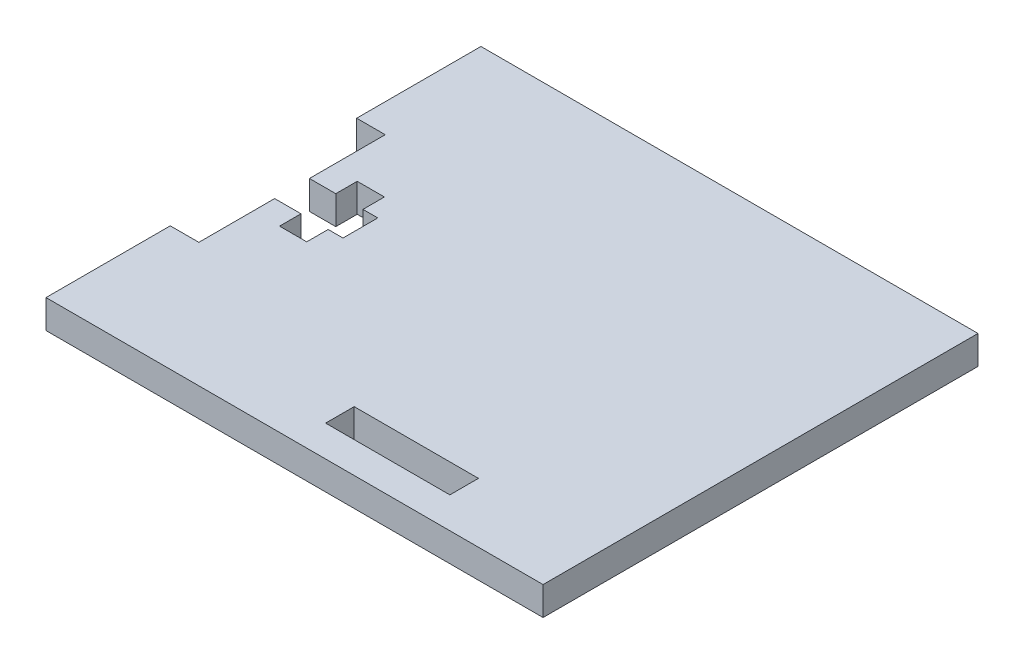
ISO-10303-21;
HEADER;
FILE_DESCRIPTION(('STEP AP214'),'2;1');
FILE_NAME('part.step','',(''),(''),'','','');
FILE_SCHEMA(('AUTOMOTIVE_DESIGN { 1 0 10303 214 1 1 1 1 }'));
ENDSEC;
DATA;
#1=APPLICATION_CONTEXT('core data for automotive mechanical design processes');
#2=APPLICATION_PROTOCOL_DEFINITION('international standard','automotive_design',2000,#1);
#3=PRODUCT_CONTEXT('',#1,'mechanical');
#4=PRODUCT('Part','Part','',(#3));
#5=PRODUCT_RELATED_PRODUCT_CATEGORY('part','',(#4));
#6=PRODUCT_DEFINITION_FORMATION('','',#4);
#7=PRODUCT_DEFINITION_CONTEXT('part definition',#1,'design');
#8=PRODUCT_DEFINITION('design','',#6,#7);
#9=PRODUCT_DEFINITION_SHAPE('','',#8);
#10=(LENGTH_UNIT() NAMED_UNIT(*) SI_UNIT(.MILLI.,.METRE.));
#11=(NAMED_UNIT(*) PLANE_ANGLE_UNIT() SI_UNIT($,.RADIAN.));
#12=(NAMED_UNIT(*) SI_UNIT($,.STERADIAN.) SOLID_ANGLE_UNIT());
#13=UNCERTAINTY_MEASURE_WITH_UNIT(LENGTH_MEASURE(1.E-05),#10,'distance_accuracy_value','');
#14=(GEOMETRIC_REPRESENTATION_CONTEXT(3) GLOBAL_UNCERTAINTY_ASSIGNED_CONTEXT((#13)) GLOBAL_UNIT_ASSIGNED_CONTEXT((#10,
#11,#12)) REPRESENTATION_CONTEXT('',''));
#15=CARTESIAN_POINT('',(0.,0.,0.));
#16=DIRECTION('',(0.,0.,1.));
#17=DIRECTION('',(1.,0.,0.));
#18=AXIS2_PLACEMENT_3D('',#15,#16,#17);
#19=CARTESIAN_POINT('',(0.,2.921,0.));
#20=DIRECTION('',(0.,-1.,0.));
#21=DIRECTION('',(0.,0.,-1.));
#22=AXIS2_PLACEMENT_3D('',#19,#20,#21);
#23=PLANE('',#22);
#24=DIRECTION('',(0.,0.,1.));
#25=VECTOR('',#24,1.);
#26=CARTESIAN_POINT('',(0.,2.921,0.));
#27=LINE('',#26,#25);
#28=CARTESIAN_POINT('',(0.,2.921,-12.7));
#29=VERTEX_POINT('',#28);
#30=CARTESIAN_POINT('',(0.,2.921,0.));
#31=VERTEX_POINT('',#30);
#32=EDGE_CURVE('E229',#29,#31,#27,.T.);
#33=ORIENTED_EDGE('',*,*,#32,.T.);
#34=DIRECTION('',(1.,0.,0.));
#35=VECTOR('',#34,1.);
#36=CARTESIAN_POINT('',(0.,2.921,0.));
#37=LINE('',#36,#35);
#38=CARTESIAN_POINT('',(50.8,2.921,0.));
#39=VERTEX_POINT('',#38);
#40=EDGE_CURVE('E232',#31,#39,#37,.T.);
#41=ORIENTED_EDGE('',*,*,#40,.T.);
#42=DIRECTION('',(0.,0.,-1.));
#43=VECTOR('',#42,1.);
#44=CARTESIAN_POINT('',(50.8,2.921,0.));
#45=LINE('',#44,#43);
#46=CARTESIAN_POINT('',(50.8,2.921,-44.45));
#47=VERTEX_POINT('',#46);
#48=EDGE_CURVE('E235',#39,#47,#45,.T.);
#49=ORIENTED_EDGE('',*,*,#48,.T.);
#50=DIRECTION('',(-1.,0.,0.));
#51=VECTOR('',#50,1.);
#52=CARTESIAN_POINT('',(0.,2.921,-44.45));
#53=LINE('',#52,#51);
#54=CARTESIAN_POINT('',(0.,2.921,-44.45));
#55=VERTEX_POINT('',#54);
#56=EDGE_CURVE('E237',#47,#55,#53,.T.);
#57=ORIENTED_EDGE('',*,*,#56,.T.);
#58=DIRECTION('',(0.,0.,1.));
#59=VECTOR('',#58,1.);
#60=CARTESIAN_POINT('',(0.,2.921,-31.75));
#61=LINE('',#60,#59);
#62=CARTESIAN_POINT('',(0.,2.921,-31.75));
#63=VERTEX_POINT('',#62);
#64=EDGE_CURVE('E239',#55,#63,#61,.T.);
#65=ORIENTED_EDGE('',*,*,#64,.T.);
#66=DIRECTION('',(1.,0.,0.));
#67=VECTOR('',#66,1.);
#68=CARTESIAN_POINT('',(0.,2.921,-31.75));
#69=LINE('',#68,#67);
#70=CARTESIAN_POINT('',(2.921,2.921,-31.75));
#71=VERTEX_POINT('',#70);
#72=EDGE_CURVE('E241',#63,#71,#69,.T.);
#73=ORIENTED_EDGE('',*,*,#72,.T.);
#74=DIRECTION('',(0.,0.,1.));
#75=VECTOR('',#74,1.);
#76=CARTESIAN_POINT('',(2.921,2.921,-24.003));
#77=LINE('',#76,#75);
#78=CARTESIAN_POINT('',(2.921,2.921,-24.003));
#79=VERTEX_POINT('',#78);
#80=EDGE_CURVE('E243',#71,#79,#77,.T.);
#81=ORIENTED_EDGE('',*,*,#80,.T.);
#82=DIRECTION('',(1.,0.,0.));
#83=VECTOR('',#82,1.);
#84=CARTESIAN_POINT('',(2.921,2.921,-24.003));
#85=LINE('',#84,#83);
#86=CARTESIAN_POINT('',(5.61233638639875,2.921,-24.003));
#87=VERTEX_POINT('',#86);
#88=EDGE_CURVE('E245',#79,#87,#85,.T.);
#89=ORIENTED_EDGE('',*,*,#88,.T.);
#90=DIRECTION('',(0.,0.,-1.));
#91=VECTOR('',#90,1.);
#92=CARTESIAN_POINT('',(5.61233638639875,2.921,-24.003));
#93=LINE('',#92,#91);
#94=CARTESIAN_POINT('',(5.61233638639875,2.921,-26.19375));
#95=VERTEX_POINT('',#94);
#96=EDGE_CURVE('E247',#87,#95,#93,.T.);
#97=ORIENTED_EDGE('',*,*,#96,.T.);
#98=DIRECTION('',(1.,0.,0.));
#99=VECTOR('',#98,1.);
#100=CARTESIAN_POINT('',(5.61233638639875,2.921,-26.19375));
#101=LINE('',#100,#99);
#102=CARTESIAN_POINT('',(8.39046138639875,2.921,-26.19375));
#103=VERTEX_POINT('',#102);
#104=EDGE_CURVE('E249',#95,#103,#101,.T.);
#105=ORIENTED_EDGE('',*,*,#104,.T.);
#106=DIRECTION('',(0.,0.,1.));
#107=VECTOR('',#106,1.);
#108=CARTESIAN_POINT('',(8.39046138639875,2.921,-24.003));
#109=LINE('',#108,#107);
#110=CARTESIAN_POINT('',(8.39046138639875,2.921,-24.003));
#111=VERTEX_POINT('',#110);
#112=EDGE_CURVE('E251',#103,#111,#109,.T.);
#113=ORIENTED_EDGE('',*,*,#112,.T.);
#114=DIRECTION('',(1.,0.,0.));
#115=VECTOR('',#114,1.);
#116=CARTESIAN_POINT('',(8.39046138639875,2.921,-24.003));
#117=LINE('',#116,#115);
#118=CARTESIAN_POINT('',(9.906,2.921,-24.003));
#119=VERTEX_POINT('',#118);
#120=EDGE_CURVE('E253',#111,#119,#117,.T.);
#121=ORIENTED_EDGE('',*,*,#120,.T.);
#122=DIRECTION('',(0.,0.,1.));
#123=VECTOR('',#122,1.);
#124=CARTESIAN_POINT('',(9.906,2.921,-20.447));
#125=LINE('',#124,#123);
#126=CARTESIAN_POINT('',(9.906,2.921,-20.447));
#127=VERTEX_POINT('',#126);
#128=EDGE_CURVE('E255',#119,#127,#125,.T.);
#129=ORIENTED_EDGE('',*,*,#128,.T.);
#130=DIRECTION('',(-1.,0.,0.));
#131=VECTOR('',#130,1.);
#132=CARTESIAN_POINT('',(8.39046138639875,2.921,-20.447));
#133=LINE('',#132,#131);
#134=CARTESIAN_POINT('',(8.39046138639875,2.921,-20.447));
#135=VERTEX_POINT('',#134);
#136=EDGE_CURVE('E257',#127,#135,#133,.T.);
#137=ORIENTED_EDGE('',*,*,#136,.T.);
#138=DIRECTION('',(0.,0.,1.));
#139=VECTOR('',#138,1.);
#140=CARTESIAN_POINT('',(8.39046138639875,2.921,-18.25625));
#141=LINE('',#140,#139);
#142=CARTESIAN_POINT('',(8.39046138639875,2.921,-18.25625));
#143=VERTEX_POINT('',#142);
#144=EDGE_CURVE('E259',#135,#143,#141,.T.);
#145=ORIENTED_EDGE('',*,*,#144,.T.);
#146=DIRECTION('',(-1.,0.,0.));
#147=VECTOR('',#146,1.);
#148=CARTESIAN_POINT('',(5.61233638639875,2.921,-18.25625));
#149=LINE('',#148,#147);
#150=CARTESIAN_POINT('',(5.61233638639875,2.921,-18.25625));
#151=VERTEX_POINT('',#150);
#152=EDGE_CURVE('E261',#143,#151,#149,.T.);
#153=ORIENTED_EDGE('',*,*,#152,.T.);
#154=DIRECTION('',(0.,0.,-1.));
#155=VECTOR('',#154,1.);
#156=CARTESIAN_POINT('',(5.61233638639875,2.921,-18.25625));
#157=LINE('',#156,#155);
#158=CARTESIAN_POINT('',(5.61233638639875,2.921,-20.447));
#159=VERTEX_POINT('',#158);
#160=EDGE_CURVE('E263',#151,#159,#157,.T.);
#161=ORIENTED_EDGE('',*,*,#160,.T.);
#162=DIRECTION('',(-1.,0.,0.));
#163=VECTOR('',#162,1.);
#164=CARTESIAN_POINT('',(2.921,2.921,-20.447));
#165=LINE('',#164,#163);
#166=CARTESIAN_POINT('',(2.921,2.921,-20.447));
#167=VERTEX_POINT('',#166);
#168=EDGE_CURVE('E265',#159,#167,#165,.T.);
#169=ORIENTED_EDGE('',*,*,#168,.T.);
#170=DIRECTION('',(0.,0.,1.));
#171=VECTOR('',#170,1.);
#172=CARTESIAN_POINT('',(2.921,2.921,-12.7));
#173=LINE('',#172,#171);
#174=CARTESIAN_POINT('',(2.921,2.921,-12.7));
#175=VERTEX_POINT('',#174);
#176=EDGE_CURVE('E267',#167,#175,#173,.T.);
#177=ORIENTED_EDGE('',*,*,#176,.T.);
#178=DIRECTION('',(-1.,0.,0.));
#179=VECTOR('',#178,1.);
#180=CARTESIAN_POINT('',(0.,2.921,-12.7));
#181=LINE('',#180,#179);
#182=EDGE_CURVE('E269',#175,#29,#181,.T.);
#183=ORIENTED_EDGE('',*,*,#182,.T.);
#184=EDGE_LOOP('',(#33,#41,#49,#57,#65,#73,#81,#89,#97,#105,#113,#121,#129,#137,#145,#153,#161,
#169,#177,#183));
#185=FACE_BOUND('',#184,.T.);
#186=DIRECTION('',(0.,0.,1.));
#187=VECTOR('',#186,1.);
#188=CARTESIAN_POINT('',(25.4,2.921,-6.096));
#189=LINE('',#188,#187);
#190=CARTESIAN_POINT('',(25.4,2.921,-6.096));
#191=VERTEX_POINT('',#190);
#192=CARTESIAN_POINT('',(25.4,2.921,-3.175));
#193=VERTEX_POINT('',#192);
#194=EDGE_CURVE('E193',#191,#193,#189,.T.);
#195=ORIENTED_EDGE('',*,*,#194,.F.);
#196=DIRECTION('',(-1.,0.,0.));
#197=VECTOR('',#196,1.);
#198=CARTESIAN_POINT('',(25.4,2.921,-6.096));
#199=LINE('',#198,#197);
#200=CARTESIAN_POINT('',(38.1,2.921,-6.096));
#201=VERTEX_POINT('',#200);
#202=EDGE_CURVE('E215',#201,#191,#199,.T.);
#203=ORIENTED_EDGE('',*,*,#202,.F.);
#204=DIRECTION('',(0.,0.,-1.));
#205=VECTOR('',#204,1.);
#206=CARTESIAN_POINT('',(38.1,2.921,-6.096));
#207=LINE('',#206,#205);
#208=CARTESIAN_POINT('',(38.1,2.921,-3.175));
#209=VERTEX_POINT('',#208);
#210=EDGE_CURVE('E213',#209,#201,#207,.T.);
#211=ORIENTED_EDGE('',*,*,#210,.F.);
#212=DIRECTION('',(1.,0.,0.));
#213=VECTOR('',#212,1.);
#214=CARTESIAN_POINT('',(25.4,2.921,-3.175));
#215=LINE('',#214,#213);
#216=EDGE_CURVE('E201',#193,#209,#215,.T.);
#217=ORIENTED_EDGE('',*,*,#216,.F.);
#218=EDGE_LOOP('',(#195,#203,#211,#217));
#219=FACE_BOUND('',#218,.T.);
#220=ADVANCED_FACE('F32',(#185,#219),#23,.F.);
#221=CARTESIAN_POINT('',(0.,0.,0.));
#222=DIRECTION('',(0.,-1.,0.));
#223=DIRECTION('',(0.,0.,-1.));
#224=AXIS2_PLACEMENT_3D('',#221,#222,#223);
#225=PLANE('',#224);
#226=DIRECTION('',(0.,0.,1.));
#227=VECTOR('',#226,1.);
#228=CARTESIAN_POINT('',(0.,0.,0.));
#229=LINE('',#228,#227);
#230=CARTESIAN_POINT('',(0.,0.,-12.7));
#231=VERTEX_POINT('',#230);
#232=CARTESIAN_POINT('',(0.,0.,0.));
#233=VERTEX_POINT('',#232);
#234=EDGE_CURVE('E209',#231,#233,#229,.T.);
#235=ORIENTED_EDGE('',*,*,#234,.F.);
#236=DIRECTION('',(-1.,0.,0.));
#237=VECTOR('',#236,1.);
#238=CARTESIAN_POINT('',(0.,0.,-12.7));
#239=LINE('',#238,#237);
#240=CARTESIAN_POINT('',(2.921,0.,-12.7));
#241=VERTEX_POINT('',#240);
#242=EDGE_CURVE('E233',#241,#231,#239,.T.);
#243=ORIENTED_EDGE('',*,*,#242,.F.);
#244=DIRECTION('',(0.,0.,1.));
#245=VECTOR('',#244,1.);
#246=CARTESIAN_POINT('',(2.921,0.,-12.7));
#247=LINE('',#246,#245);
#248=CARTESIAN_POINT('',(2.921,0.,-20.447));
#249=VERTEX_POINT('',#248);
#250=EDGE_CURVE('E308',#249,#241,#247,.T.);
#251=ORIENTED_EDGE('',*,*,#250,.F.);
#252=DIRECTION('',(-1.,0.,0.));
#253=VECTOR('',#252,1.);
#254=CARTESIAN_POINT('',(2.921,0.,-20.447));
#255=LINE('',#254,#253);
#256=CARTESIAN_POINT('',(5.61233638639875,0.,-20.447));
#257=VERTEX_POINT('',#256);
#258=EDGE_CURVE('E306',#257,#249,#255,.T.);
#259=ORIENTED_EDGE('',*,*,#258,.F.);
#260=DIRECTION('',(0.,0.,-1.));
#261=VECTOR('',#260,1.);
#262=CARTESIAN_POINT('',(5.61233638639875,0.,-18.25625));
#263=LINE('',#262,#261);
#264=CARTESIAN_POINT('',(5.61233638639875,0.,-18.25625));
#265=VERTEX_POINT('',#264);
#266=EDGE_CURVE('E304',#265,#257,#263,.T.);
#267=ORIENTED_EDGE('',*,*,#266,.F.);
#268=DIRECTION('',(-1.,0.,0.));
#269=VECTOR('',#268,1.);
#270=CARTESIAN_POINT('',(5.61233638639875,0.,-18.25625));
#271=LINE('',#270,#269);
#272=CARTESIAN_POINT('',(8.39046138639875,0.,-18.25625));
#273=VERTEX_POINT('',#272);
#274=EDGE_CURVE('E302',#273,#265,#271,.T.);
#275=ORIENTED_EDGE('',*,*,#274,.F.);
#276=DIRECTION('',(0.,0.,1.));
#277=VECTOR('',#276,1.);
#278=CARTESIAN_POINT('',(8.39046138639875,0.,-18.25625));
#279=LINE('',#278,#277);
#280=CARTESIAN_POINT('',(8.39046138639875,0.,-20.447));
#281=VERTEX_POINT('',#280);
#282=EDGE_CURVE('E300',#281,#273,#279,.T.);
#283=ORIENTED_EDGE('',*,*,#282,.F.);
#284=DIRECTION('',(-1.,0.,0.));
#285=VECTOR('',#284,1.);
#286=CARTESIAN_POINT('',(8.39046138639875,0.,-20.447));
#287=LINE('',#286,#285);
#288=CARTESIAN_POINT('',(9.906,0.,-20.447));
#289=VERTEX_POINT('',#288);
#290=EDGE_CURVE('E298',#289,#281,#287,.T.);
#291=ORIENTED_EDGE('',*,*,#290,.F.);
#292=DIRECTION('',(0.,0.,1.));
#293=VECTOR('',#292,1.);
#294=CARTESIAN_POINT('',(9.906,0.,-20.447));
#295=LINE('',#294,#293);
#296=CARTESIAN_POINT('',(9.906,0.,-24.003));
#297=VERTEX_POINT('',#296);
#298=EDGE_CURVE('E296',#297,#289,#295,.T.);
#299=ORIENTED_EDGE('',*,*,#298,.F.);
#300=DIRECTION('',(1.,0.,0.));
#301=VECTOR('',#300,1.);
#302=CARTESIAN_POINT('',(8.39046138639875,0.,-24.003));
#303=LINE('',#302,#301);
#304=CARTESIAN_POINT('',(8.39046138639875,0.,-24.003));
#305=VERTEX_POINT('',#304);
#306=EDGE_CURVE('E294',#305,#297,#303,.T.);
#307=ORIENTED_EDGE('',*,*,#306,.F.);
#308=DIRECTION('',(0.,0.,1.));
#309=VECTOR('',#308,1.);
#310=CARTESIAN_POINT('',(8.39046138639875,0.,-24.003));
#311=LINE('',#310,#309);
#312=CARTESIAN_POINT('',(8.39046138639875,0.,-26.19375));
#313=VERTEX_POINT('',#312);
#314=EDGE_CURVE('E292',#313,#305,#311,.T.);
#315=ORIENTED_EDGE('',*,*,#314,.F.);
#316=DIRECTION('',(1.,0.,0.));
#317=VECTOR('',#316,1.);
#318=CARTESIAN_POINT('',(5.61233638639875,0.,-26.19375));
#319=LINE('',#318,#317);
#320=CARTESIAN_POINT('',(5.61233638639875,0.,-26.19375));
#321=VERTEX_POINT('',#320);
#322=EDGE_CURVE('E290',#321,#313,#319,.T.);
#323=ORIENTED_EDGE('',*,*,#322,.F.);
#324=DIRECTION('',(0.,0.,-1.));
#325=VECTOR('',#324,1.);
#326=CARTESIAN_POINT('',(5.61233638639875,0.,-24.003));
#327=LINE('',#326,#325);
#328=CARTESIAN_POINT('',(5.61233638639875,0.,-24.003));
#329=VERTEX_POINT('',#328);
#330=EDGE_CURVE('E288',#329,#321,#327,.T.);
#331=ORIENTED_EDGE('',*,*,#330,.F.);
#332=DIRECTION('',(1.,0.,0.));
#333=VECTOR('',#332,1.);
#334=CARTESIAN_POINT('',(2.921,0.,-24.003));
#335=LINE('',#334,#333);
#336=CARTESIAN_POINT('',(2.921,0.,-24.003));
#337=VERTEX_POINT('',#336);
#338=EDGE_CURVE('E286',#337,#329,#335,.T.);
#339=ORIENTED_EDGE('',*,*,#338,.F.);
#340=DIRECTION('',(0.,0.,1.));
#341=VECTOR('',#340,1.);
#342=CARTESIAN_POINT('',(2.921,0.,-24.003));
#343=LINE('',#342,#341);
#344=CARTESIAN_POINT('',(2.921,0.,-31.75));
#345=VERTEX_POINT('',#344);
#346=EDGE_CURVE('E284',#345,#337,#343,.T.);
#347=ORIENTED_EDGE('',*,*,#346,.F.);
#348=DIRECTION('',(1.,0.,0.));
#349=VECTOR('',#348,1.);
#350=CARTESIAN_POINT('',(0.,0.,-31.75));
#351=LINE('',#350,#349);
#352=CARTESIAN_POINT('',(0.,0.,-31.75));
#353=VERTEX_POINT('',#352);
#354=EDGE_CURVE('E282',#353,#345,#351,.T.);
#355=ORIENTED_EDGE('',*,*,#354,.F.);
#356=DIRECTION('',(0.,0.,1.));
#357=VECTOR('',#356,1.);
#358=CARTESIAN_POINT('',(0.,0.,-31.75));
#359=LINE('',#358,#357);
#360=CARTESIAN_POINT('',(0.,0.,-44.45));
#361=VERTEX_POINT('',#360);
#362=EDGE_CURVE('E280',#361,#353,#359,.T.);
#363=ORIENTED_EDGE('',*,*,#362,.F.);
#364=DIRECTION('',(-1.,0.,0.));
#365=VECTOR('',#364,1.);
#366=CARTESIAN_POINT('',(0.,0.,-44.45));
#367=LINE('',#366,#365);
#368=CARTESIAN_POINT('',(50.8,0.,-44.45));
#369=VERTEX_POINT('',#368);
#370=EDGE_CURVE('E278',#369,#361,#367,.T.);
#371=ORIENTED_EDGE('',*,*,#370,.F.);
#372=DIRECTION('',(0.,0.,-1.));
#373=VECTOR('',#372,1.);
#374=CARTESIAN_POINT('',(50.8,0.,0.));
#375=LINE('',#374,#373);
#376=CARTESIAN_POINT('',(50.8,0.,0.));
#377=VERTEX_POINT('',#376);
#378=EDGE_CURVE('E276',#377,#369,#375,.T.);
#379=ORIENTED_EDGE('',*,*,#378,.F.);
#380=DIRECTION('',(1.,0.,0.));
#381=VECTOR('',#380,1.);
#382=CARTESIAN_POINT('',(0.,0.,0.));
#383=LINE('',#382,#381);
#384=EDGE_CURVE('E274',#233,#377,#383,.T.);
#385=ORIENTED_EDGE('',*,*,#384,.F.);
#386=EDGE_LOOP('',(#235,#243,#251,#259,#267,#275,#283,#291,#299,#307,#315,#323,#331,#339,#347,
#355,#363,#371,#379,#385));
#387=FACE_BOUND('',#386,.T.);
#388=DIRECTION('',(-1.,0.,0.));
#389=VECTOR('',#388,1.);
#390=CARTESIAN_POINT('',(25.4,0.,-6.096));
#391=LINE('',#390,#389);
#392=CARTESIAN_POINT('',(38.1,0.,-6.096));
#393=VERTEX_POINT('',#392);
#394=CARTESIAN_POINT('',(25.4,0.,-6.096));
#395=VERTEX_POINT('',#394);
#396=EDGE_CURVE('E202',#393,#395,#391,.T.);
#397=ORIENTED_EDGE('',*,*,#396,.T.);
#398=DIRECTION('',(0.,0.,1.));
#399=VECTOR('',#398,1.);
#400=CARTESIAN_POINT('',(25.4,0.,-6.096));
#401=LINE('',#400,#399);
#402=CARTESIAN_POINT('',(25.4,0.,-3.175));
#403=VERTEX_POINT('',#402);
#404=EDGE_CURVE('E55',#395,#403,#401,.T.);
#405=ORIENTED_EDGE('',*,*,#404,.T.);
#406=DIRECTION('',(1.,0.,0.));
#407=VECTOR('',#406,1.);
#408=CARTESIAN_POINT('',(25.4,0.,-3.175));
#409=LINE('',#408,#407);
#410=CARTESIAN_POINT('',(38.1,0.,-3.175));
#411=VERTEX_POINT('',#410);
#412=EDGE_CURVE('E208',#403,#411,#409,.T.);
#413=ORIENTED_EDGE('',*,*,#412,.T.);
#414=DIRECTION('',(0.,0.,-1.));
#415=VECTOR('',#414,1.);
#416=CARTESIAN_POINT('',(38.1,0.,-6.096));
#417=LINE('',#416,#415);
#418=EDGE_CURVE('E221',#411,#393,#417,.T.);
#419=ORIENTED_EDGE('',*,*,#418,.T.);
#420=EDGE_LOOP('',(#397,#405,#413,#419));
#421=FACE_BOUND('',#420,.T.);
#422=ADVANCED_FACE('F374',(#387,#421),#225,.T.);
#423=CARTESIAN_POINT('',(0.,2.921,0.));
#424=DIRECTION('',(1.,0.,0.));
#425=DIRECTION('',(0.,0.,-1.));
#426=AXIS2_PLACEMENT_3D('',#423,#424,#425);
#427=PLANE('',#426);
#428=ORIENTED_EDGE('',*,*,#234,.T.);
#429=DIRECTION('',(0.,-1.,0.));
#430=VECTOR('',#429,1.);
#431=CARTESIAN_POINT('',(0.,2.921,0.));
#432=LINE('',#431,#430);
#433=EDGE_CURVE('E11',#31,#233,#432,.T.);
#434=ORIENTED_EDGE('',*,*,#433,.F.);
#435=ORIENTED_EDGE('',*,*,#32,.F.);
#436=DIRECTION('',(0.,-1.,0.));
#437=VECTOR('',#436,1.);
#438=CARTESIAN_POINT('',(0.,2.921,-12.7));
#439=LINE('',#438,#437);
#440=EDGE_CURVE('E271',#29,#231,#439,.T.);
#441=ORIENTED_EDGE('',*,*,#440,.T.);
#442=EDGE_LOOP('',(#428,#434,#435,#441));
#443=FACE_BOUND('',#442,.T.);
#444=ADVANCED_FACE('F34',(#443),#427,.F.);
#445=CARTESIAN_POINT('',(0.,2.921,0.));
#446=DIRECTION('',(0.,0.,-1.));
#447=DIRECTION('',(-1.,0.,0.));
#448=AXIS2_PLACEMENT_3D('',#445,#446,#447);
#449=PLANE('',#448);
#450=ORIENTED_EDGE('',*,*,#384,.T.);
#451=DIRECTION('',(0.,-1.,0.));
#452=VECTOR('',#451,1.);
#453=CARTESIAN_POINT('',(50.8,2.921,0.));
#454=LINE('',#453,#452);
#455=EDGE_CURVE('E40',#39,#377,#454,.T.);
#456=ORIENTED_EDGE('',*,*,#455,.F.);
#457=ORIENTED_EDGE('',*,*,#40,.F.);
#458=ORIENTED_EDGE('',*,*,#433,.T.);
#459=EDGE_LOOP('',(#450,#456,#457,#458));
#460=FACE_BOUND('',#459,.T.);
#461=ADVANCED_FACE('F391',(#460),#449,.F.);
#462=CARTESIAN_POINT('',(50.8,2.921,0.));
#463=DIRECTION('',(-1.,0.,0.));
#464=DIRECTION('',(0.,0.,1.));
#465=AXIS2_PLACEMENT_3D('',#462,#463,#464);
#466=PLANE('',#465);
#467=ORIENTED_EDGE('',*,*,#378,.T.);
#468=DIRECTION('',(0.,-1.,0.));
#469=VECTOR('',#468,1.);
#470=CARTESIAN_POINT('',(50.8,2.921,-44.45));
#471=LINE('',#470,#469);
#472=EDGE_CURVE('E361',#47,#369,#471,.T.);
#473=ORIENTED_EDGE('',*,*,#472,.F.);
#474=ORIENTED_EDGE('',*,*,#48,.F.);
#475=ORIENTED_EDGE('',*,*,#455,.T.);
#476=EDGE_LOOP('',(#467,#473,#474,#475));
#477=FACE_BOUND('',#476,.T.);
#478=ADVANCED_FACE('F368',(#477),#466,.F.);
#479=CARTESIAN_POINT('',(0.,2.921,-44.45));
#480=DIRECTION('',(0.,0.,1.));
#481=DIRECTION('',(1.,0.,0.));
#482=AXIS2_PLACEMENT_3D('',#479,#480,#481);
#483=PLANE('',#482);
#484=ORIENTED_EDGE('',*,*,#370,.T.);
#485=DIRECTION('',(0.,-1.,0.));
#486=VECTOR('',#485,1.);
#487=CARTESIAN_POINT('',(0.,2.921,-44.45));
#488=LINE('',#487,#486);
#489=EDGE_CURVE('E358',#55,#361,#488,.T.);
#490=ORIENTED_EDGE('',*,*,#489,.F.);
#491=ORIENTED_EDGE('',*,*,#56,.F.);
#492=ORIENTED_EDGE('',*,*,#472,.T.);
#493=EDGE_LOOP('',(#484,#490,#491,#492));
#494=FACE_BOUND('',#493,.T.);
#495=ADVANCED_FACE('F380',(#494),#483,.F.);
#496=CARTESIAN_POINT('',(0.,2.921,-31.75));
#497=DIRECTION('',(1.,0.,0.));
#498=DIRECTION('',(0.,0.,-1.));
#499=AXIS2_PLACEMENT_3D('',#496,#497,#498);
#500=PLANE('',#499);
#501=ORIENTED_EDGE('',*,*,#362,.T.);
#502=DIRECTION('',(0.,-1.,0.));
#503=VECTOR('',#502,1.);
#504=CARTESIAN_POINT('',(0.,2.921,-31.75));
#505=LINE('',#504,#503);
#506=EDGE_CURVE('E355',#63,#353,#505,.T.);
#507=ORIENTED_EDGE('',*,*,#506,.F.);
#508=ORIENTED_EDGE('',*,*,#64,.F.);
#509=ORIENTED_EDGE('',*,*,#489,.T.);
#510=EDGE_LOOP('',(#501,#507,#508,#509));
#511=FACE_BOUND('',#510,.T.);
#512=ADVANCED_FACE('F384',(#511),#500,.F.);
#513=CARTESIAN_POINT('',(0.,2.921,-31.75));
#514=DIRECTION('',(0.,0.,-1.));
#515=DIRECTION('',(-1.,0.,0.));
#516=AXIS2_PLACEMENT_3D('',#513,#514,#515);
#517=PLANE('',#516);
#518=ORIENTED_EDGE('',*,*,#354,.T.);
#519=DIRECTION('',(0.,-1.,0.));
#520=VECTOR('',#519,1.);
#521=CARTESIAN_POINT('',(2.921,2.921,-31.75));
#522=LINE('',#521,#520);
#523=EDGE_CURVE('E352',#71,#345,#522,.T.);
#524=ORIENTED_EDGE('',*,*,#523,.F.);
#525=ORIENTED_EDGE('',*,*,#72,.F.);
#526=ORIENTED_EDGE('',*,*,#506,.T.);
#527=EDGE_LOOP('',(#518,#524,#525,#526));
#528=FACE_BOUND('',#527,.T.);
#529=ADVANCED_FACE('F464',(#528),#517,.F.);
#530=CARTESIAN_POINT('',(2.921,2.921,-24.003));
#531=DIRECTION('',(1.,0.,0.));
#532=DIRECTION('',(0.,0.,-1.));
#533=AXIS2_PLACEMENT_3D('',#530,#531,#532);
#534=PLANE('',#533);
#535=ORIENTED_EDGE('',*,*,#346,.T.);
#536=DIRECTION('',(0.,-1.,0.));
#537=VECTOR('',#536,1.);
#538=CARTESIAN_POINT('',(2.921,2.921,-24.003));
#539=LINE('',#538,#537);
#540=EDGE_CURVE('E349',#79,#337,#539,.T.);
#541=ORIENTED_EDGE('',*,*,#540,.F.);
#542=ORIENTED_EDGE('',*,*,#80,.F.);
#543=ORIENTED_EDGE('',*,*,#523,.T.);
#544=EDGE_LOOP('',(#535,#541,#542,#543));
#545=FACE_BOUND('',#544,.T.);
#546=ADVANCED_FACE('F462',(#545),#534,.F.);
#547=CARTESIAN_POINT('',(2.921,2.921,-24.003));
#548=DIRECTION('',(0.,0.,-1.));
#549=DIRECTION('',(-1.,0.,0.));
#550=AXIS2_PLACEMENT_3D('',#547,#548,#549);
#551=PLANE('',#550);
#552=ORIENTED_EDGE('',*,*,#338,.T.);
#553=DIRECTION('',(0.,-1.,0.));
#554=VECTOR('',#553,1.);
#555=CARTESIAN_POINT('',(5.61233638639875,2.921,-24.003));
#556=LINE('',#555,#554);
#557=EDGE_CURVE('E346',#87,#329,#556,.T.);
#558=ORIENTED_EDGE('',*,*,#557,.F.);
#559=ORIENTED_EDGE('',*,*,#88,.F.);
#560=ORIENTED_EDGE('',*,*,#540,.T.);
#561=EDGE_LOOP('',(#552,#558,#559,#560));
#562=FACE_BOUND('',#561,.T.);
#563=ADVANCED_FACE('F457',(#562),#551,.F.);
#564=CARTESIAN_POINT('',(5.61233638639875,2.921,-24.003));
#565=DIRECTION('',(-1.,0.,0.));
#566=DIRECTION('',(0.,0.,1.));
#567=AXIS2_PLACEMENT_3D('',#564,#565,#566);
#568=PLANE('',#567);
#569=ORIENTED_EDGE('',*,*,#330,.T.);
#570=DIRECTION('',(0.,-1.,0.));
#571=VECTOR('',#570,1.);
#572=CARTESIAN_POINT('',(5.61233638639875,2.921,-26.19375));
#573=LINE('',#572,#571);
#574=EDGE_CURVE('E343',#95,#321,#573,.T.);
#575=ORIENTED_EDGE('',*,*,#574,.F.);
#576=ORIENTED_EDGE('',*,*,#96,.F.);
#577=ORIENTED_EDGE('',*,*,#557,.T.);
#578=EDGE_LOOP('',(#569,#575,#576,#577));
#579=FACE_BOUND('',#578,.T.);
#580=ADVANCED_FACE('F452',(#579),#568,.F.);
#581=CARTESIAN_POINT('',(5.61233638639875,2.921,-26.19375));
#582=DIRECTION('',(0.,0.,-1.));
#583=DIRECTION('',(-1.,0.,0.));
#584=AXIS2_PLACEMENT_3D('',#581,#582,#583);
#585=PLANE('',#584);
#586=ORIENTED_EDGE('',*,*,#322,.T.);
#587=DIRECTION('',(0.,-1.,0.));
#588=VECTOR('',#587,1.);
#589=CARTESIAN_POINT('',(8.39046138639875,2.921,-26.19375));
#590=LINE('',#589,#588);
#591=EDGE_CURVE('E340',#103,#313,#590,.T.);
#592=ORIENTED_EDGE('',*,*,#591,.F.);
#593=ORIENTED_EDGE('',*,*,#104,.F.);
#594=ORIENTED_EDGE('',*,*,#574,.T.);
#595=EDGE_LOOP('',(#586,#592,#593,#594));
#596=FACE_BOUND('',#595,.T.);
#597=ADVANCED_FACE('F448',(#596),#585,.F.);
#598=CARTESIAN_POINT('',(8.39046138639875,2.921,-24.003));
#599=DIRECTION('',(1.,0.,0.));
#600=DIRECTION('',(0.,0.,-1.));
#601=AXIS2_PLACEMENT_3D('',#598,#599,#600);
#602=PLANE('',#601);
#603=ORIENTED_EDGE('',*,*,#314,.T.);
#604=DIRECTION('',(0.,-1.,0.));
#605=VECTOR('',#604,1.);
#606=CARTESIAN_POINT('',(8.39046138639875,2.921,-24.003));
#607=LINE('',#606,#605);
#608=EDGE_CURVE('E337',#111,#305,#607,.T.);
#609=ORIENTED_EDGE('',*,*,#608,.F.);
#610=ORIENTED_EDGE('',*,*,#112,.F.);
#611=ORIENTED_EDGE('',*,*,#591,.T.);
#612=EDGE_LOOP('',(#603,#609,#610,#611));
#613=FACE_BOUND('',#612,.T.);
#614=ADVANCED_FACE('F443',(#613),#602,.F.);
#615=CARTESIAN_POINT('',(8.39046138639875,2.921,-24.003));
#616=DIRECTION('',(0.,0.,-1.));
#617=DIRECTION('',(-1.,0.,0.));
#618=AXIS2_PLACEMENT_3D('',#615,#616,#617);
#619=PLANE('',#618);
#620=ORIENTED_EDGE('',*,*,#306,.T.);
#621=DIRECTION('',(0.,-1.,0.));
#622=VECTOR('',#621,1.);
#623=CARTESIAN_POINT('',(9.906,2.921,-24.003));
#624=LINE('',#623,#622);
#625=EDGE_CURVE('E334',#119,#297,#624,.T.);
#626=ORIENTED_EDGE('',*,*,#625,.F.);
#627=ORIENTED_EDGE('',*,*,#120,.F.);
#628=ORIENTED_EDGE('',*,*,#608,.T.);
#629=EDGE_LOOP('',(#620,#626,#627,#628));
#630=FACE_BOUND('',#629,.T.);
#631=ADVANCED_FACE('F437',(#630),#619,.F.);
#632=CARTESIAN_POINT('',(9.906,2.921,-20.447));
#633=DIRECTION('',(1.,0.,0.));
#634=DIRECTION('',(0.,0.,-1.));
#635=AXIS2_PLACEMENT_3D('',#632,#633,#634);
#636=PLANE('',#635);
#637=ORIENTED_EDGE('',*,*,#298,.T.);
#638=DIRECTION('',(0.,-1.,0.));
#639=VECTOR('',#638,1.);
#640=CARTESIAN_POINT('',(9.906,2.921,-20.447));
#641=LINE('',#640,#639);
#642=EDGE_CURVE('E331',#127,#289,#641,.T.);
#643=ORIENTED_EDGE('',*,*,#642,.F.);
#644=ORIENTED_EDGE('',*,*,#128,.F.);
#645=ORIENTED_EDGE('',*,*,#625,.T.);
#646=EDGE_LOOP('',(#637,#643,#644,#645));
#647=FACE_BOUND('',#646,.T.);
#648=ADVANCED_FACE('F433',(#647),#636,.F.);
#649=CARTESIAN_POINT('',(8.39046138639875,2.921,-20.447));
#650=DIRECTION('',(0.,0.,1.));
#651=DIRECTION('',(1.,0.,0.));
#652=AXIS2_PLACEMENT_3D('',#649,#650,#651);
#653=PLANE('',#652);
#654=ORIENTED_EDGE('',*,*,#290,.T.);
#655=DIRECTION('',(0.,-1.,0.));
#656=VECTOR('',#655,1.);
#657=CARTESIAN_POINT('',(8.39046138639875,2.921,-20.447));
#658=LINE('',#657,#656);
#659=EDGE_CURVE('E328',#135,#281,#658,.T.);
#660=ORIENTED_EDGE('',*,*,#659,.F.);
#661=ORIENTED_EDGE('',*,*,#136,.F.);
#662=ORIENTED_EDGE('',*,*,#642,.T.);
#663=EDGE_LOOP('',(#654,#660,#661,#662));
#664=FACE_BOUND('',#663,.T.);
#665=ADVANCED_FACE('F428',(#664),#653,.F.);
#666=CARTESIAN_POINT('',(8.39046138639875,2.921,-18.25625));
#667=DIRECTION('',(1.,0.,0.));
#668=DIRECTION('',(0.,0.,-1.));
#669=AXIS2_PLACEMENT_3D('',#666,#667,#668);
#670=PLANE('',#669);
#671=ORIENTED_EDGE('',*,*,#282,.T.);
#672=DIRECTION('',(0.,-1.,0.));
#673=VECTOR('',#672,1.);
#674=CARTESIAN_POINT('',(8.39046138639875,2.921,-18.25625));
#675=LINE('',#674,#673);
#676=EDGE_CURVE('E325',#143,#273,#675,.T.);
#677=ORIENTED_EDGE('',*,*,#676,.F.);
#678=ORIENTED_EDGE('',*,*,#144,.F.);
#679=ORIENTED_EDGE('',*,*,#659,.T.);
#680=EDGE_LOOP('',(#671,#677,#678,#679));
#681=FACE_BOUND('',#680,.T.);
#682=ADVANCED_FACE('F422',(#681),#670,.F.);
#683=CARTESIAN_POINT('',(5.61233638639875,2.921,-18.25625));
#684=DIRECTION('',(0.,0.,1.));
#685=DIRECTION('',(1.,0.,0.));
#686=AXIS2_PLACEMENT_3D('',#683,#684,#685);
#687=PLANE('',#686);
#688=ORIENTED_EDGE('',*,*,#274,.T.);
#689=DIRECTION('',(0.,-1.,0.));
#690=VECTOR('',#689,1.);
#691=CARTESIAN_POINT('',(5.61233638639875,2.921,-18.25625));
#692=LINE('',#691,#690);
#693=EDGE_CURVE('E322',#151,#265,#692,.T.);
#694=ORIENTED_EDGE('',*,*,#693,.F.);
#695=ORIENTED_EDGE('',*,*,#152,.F.);
#696=ORIENTED_EDGE('',*,*,#676,.T.);
#697=EDGE_LOOP('',(#688,#694,#695,#696));
#698=FACE_BOUND('',#697,.T.);
#699=ADVANCED_FACE('F418',(#698),#687,.F.);
#700=CARTESIAN_POINT('',(5.61233638639875,2.921,-18.25625));
#701=DIRECTION('',(-1.,0.,0.));
#702=DIRECTION('',(0.,0.,1.));
#703=AXIS2_PLACEMENT_3D('',#700,#701,#702);
#704=PLANE('',#703);
#705=ORIENTED_EDGE('',*,*,#266,.T.);
#706=DIRECTION('',(0.,-1.,0.));
#707=VECTOR('',#706,1.);
#708=CARTESIAN_POINT('',(5.61233638639875,2.921,-20.447));
#709=LINE('',#708,#707);
#710=EDGE_CURVE('E319',#159,#257,#709,.T.);
#711=ORIENTED_EDGE('',*,*,#710,.F.);
#712=ORIENTED_EDGE('',*,*,#160,.F.);
#713=ORIENTED_EDGE('',*,*,#693,.T.);
#714=EDGE_LOOP('',(#705,#711,#712,#713));
#715=FACE_BOUND('',#714,.T.);
#716=ADVANCED_FACE('F413',(#715),#704,.F.);
#717=CARTESIAN_POINT('',(2.921,2.921,-20.447));
#718=DIRECTION('',(0.,0.,1.));
#719=DIRECTION('',(1.,0.,0.));
#720=AXIS2_PLACEMENT_3D('',#717,#718,#719);
#721=PLANE('',#720);
#722=ORIENTED_EDGE('',*,*,#258,.T.);
#723=DIRECTION('',(0.,-1.,0.));
#724=VECTOR('',#723,1.);
#725=CARTESIAN_POINT('',(2.921,2.921,-20.447));
#726=LINE('',#725,#724);
#727=EDGE_CURVE('E316',#167,#249,#726,.T.);
#728=ORIENTED_EDGE('',*,*,#727,.F.);
#729=ORIENTED_EDGE('',*,*,#168,.F.);
#730=ORIENTED_EDGE('',*,*,#710,.T.);
#731=EDGE_LOOP('',(#722,#728,#729,#730));
#732=FACE_BOUND('',#731,.T.);
#733=ADVANCED_FACE('F407',(#732),#721,.F.);
#734=CARTESIAN_POINT('',(2.921,2.921,-12.7));
#735=DIRECTION('',(1.,0.,0.));
#736=DIRECTION('',(0.,0.,-1.));
#737=AXIS2_PLACEMENT_3D('',#734,#735,#736);
#738=PLANE('',#737);
#739=ORIENTED_EDGE('',*,*,#250,.T.);
#740=DIRECTION('',(0.,-1.,0.));
#741=VECTOR('',#740,1.);
#742=CARTESIAN_POINT('',(2.921,2.921,-12.7));
#743=LINE('',#742,#741);
#744=EDGE_CURVE('E313',#175,#241,#743,.T.);
#745=ORIENTED_EDGE('',*,*,#744,.F.);
#746=ORIENTED_EDGE('',*,*,#176,.F.);
#747=ORIENTED_EDGE('',*,*,#727,.T.);
#748=EDGE_LOOP('',(#739,#745,#746,#747));
#749=FACE_BOUND('',#748,.T.);
#750=ADVANCED_FACE('F403',(#749),#738,.F.);
#751=CARTESIAN_POINT('',(0.,2.921,-12.7));
#752=DIRECTION('',(0.,0.,1.));
#753=DIRECTION('',(1.,0.,0.));
#754=AXIS2_PLACEMENT_3D('',#751,#752,#753);
#755=PLANE('',#754);
#756=ORIENTED_EDGE('',*,*,#242,.T.);
#757=ORIENTED_EDGE('',*,*,#440,.F.);
#758=ORIENTED_EDGE('',*,*,#182,.F.);
#759=ORIENTED_EDGE('',*,*,#744,.T.);
#760=EDGE_LOOP('',(#756,#757,#758,#759));
#761=FACE_BOUND('',#760,.T.);
#762=ADVANCED_FACE('F398',(#761),#755,.F.);
#763=CARTESIAN_POINT('',(25.4,2.921,-6.096));
#764=DIRECTION('',(1.,0.,0.));
#765=DIRECTION('',(0.,0.,-1.));
#766=AXIS2_PLACEMENT_3D('',#763,#764,#765);
#767=PLANE('',#766);
#768=ORIENTED_EDGE('',*,*,#404,.F.);
#769=DIRECTION('',(0.,-1.,0.));
#770=VECTOR('',#769,1.);
#771=CARTESIAN_POINT('',(25.4,2.921,-6.096));
#772=LINE('',#771,#770);
#773=EDGE_CURVE('E197',#191,#395,#772,.T.);
#774=ORIENTED_EDGE('',*,*,#773,.F.);
#775=ORIENTED_EDGE('',*,*,#194,.T.);
#776=DIRECTION('',(0.,-1.,0.));
#777=VECTOR('',#776,1.);
#778=CARTESIAN_POINT('',(25.4,2.921,-3.175));
#779=LINE('',#778,#777);
#780=EDGE_CURVE('E196',#193,#403,#779,.T.);
#781=ORIENTED_EDGE('',*,*,#780,.T.);
#782=EDGE_LOOP('',(#768,#774,#775,#781));
#783=FACE_BOUND('',#782,.T.);
#784=ADVANCED_FACE('F195',(#783),#767,.T.);
#785=CARTESIAN_POINT('',(25.4,2.921,-3.175));
#786=DIRECTION('',(0.,0.,-1.));
#787=DIRECTION('',(-1.,0.,0.));
#788=AXIS2_PLACEMENT_3D('',#785,#786,#787);
#789=PLANE('',#788);
#790=ORIENTED_EDGE('',*,*,#412,.F.);
#791=ORIENTED_EDGE('',*,*,#780,.F.);
#792=ORIENTED_EDGE('',*,*,#216,.T.);
#793=DIRECTION('',(0.,-1.,0.));
#794=VECTOR('',#793,1.);
#795=CARTESIAN_POINT('',(38.1,2.921,-3.175));
#796=LINE('',#795,#794);
#797=EDGE_CURVE('E210',#209,#411,#796,.T.);
#798=ORIENTED_EDGE('',*,*,#797,.T.);
#799=EDGE_LOOP('',(#790,#791,#792,#798));
#800=FACE_BOUND('',#799,.T.);
#801=ADVANCED_FACE('F205',(#800),#789,.T.);
#802=CARTESIAN_POINT('',(38.1,2.921,-6.096));
#803=DIRECTION('',(-1.,0.,0.));
#804=DIRECTION('',(0.,0.,1.));
#805=AXIS2_PLACEMENT_3D('',#802,#803,#804);
#806=PLANE('',#805);
#807=ORIENTED_EDGE('',*,*,#418,.F.);
#808=ORIENTED_EDGE('',*,*,#797,.F.);
#809=ORIENTED_EDGE('',*,*,#210,.T.);
#810=DIRECTION('',(0.,-1.,0.));
#811=VECTOR('',#810,1.);
#812=CARTESIAN_POINT('',(38.1,2.921,-6.096));
#813=LINE('',#812,#811);
#814=EDGE_CURVE('E47',#201,#393,#813,.T.);
#815=ORIENTED_EDGE('',*,*,#814,.T.);
#816=EDGE_LOOP('',(#807,#808,#809,#815));
#817=FACE_BOUND('',#816,.T.);
#818=ADVANCED_FACE('F570',(#817),#806,.T.);
#819=CARTESIAN_POINT('',(25.4,2.921,-6.096));
#820=DIRECTION('',(0.,0.,1.));
#821=DIRECTION('',(1.,0.,0.));
#822=AXIS2_PLACEMENT_3D('',#819,#820,#821);
#823=PLANE('',#822);
#824=ORIENTED_EDGE('',*,*,#396,.F.);
#825=ORIENTED_EDGE('',*,*,#814,.F.);
#826=ORIENTED_EDGE('',*,*,#202,.T.);
#827=ORIENTED_EDGE('',*,*,#773,.T.);
#828=EDGE_LOOP('',(#824,#825,#826,#827));
#829=FACE_BOUND('',#828,.T.);
#830=ADVANCED_FACE('F576',(#829),#823,.T.);
#831=CLOSED_SHELL('',(#220,#422,#444,#461,#478,#495,#512,#529,#546,#563,#580,#597,#614,#631,
#648,#665,#682,#699,#716,#733,#750,#762,#784,#801,#818,#830));
#832=MANIFOLD_SOLID_BREP('B2',#831);
#833=ADVANCED_BREP_SHAPE_REPRESENTATION('',(#18,#832),#14);
#834=SHAPE_DEFINITION_REPRESENTATION(#9,#833);
ENDSEC;
END-ISO-10303-21;
